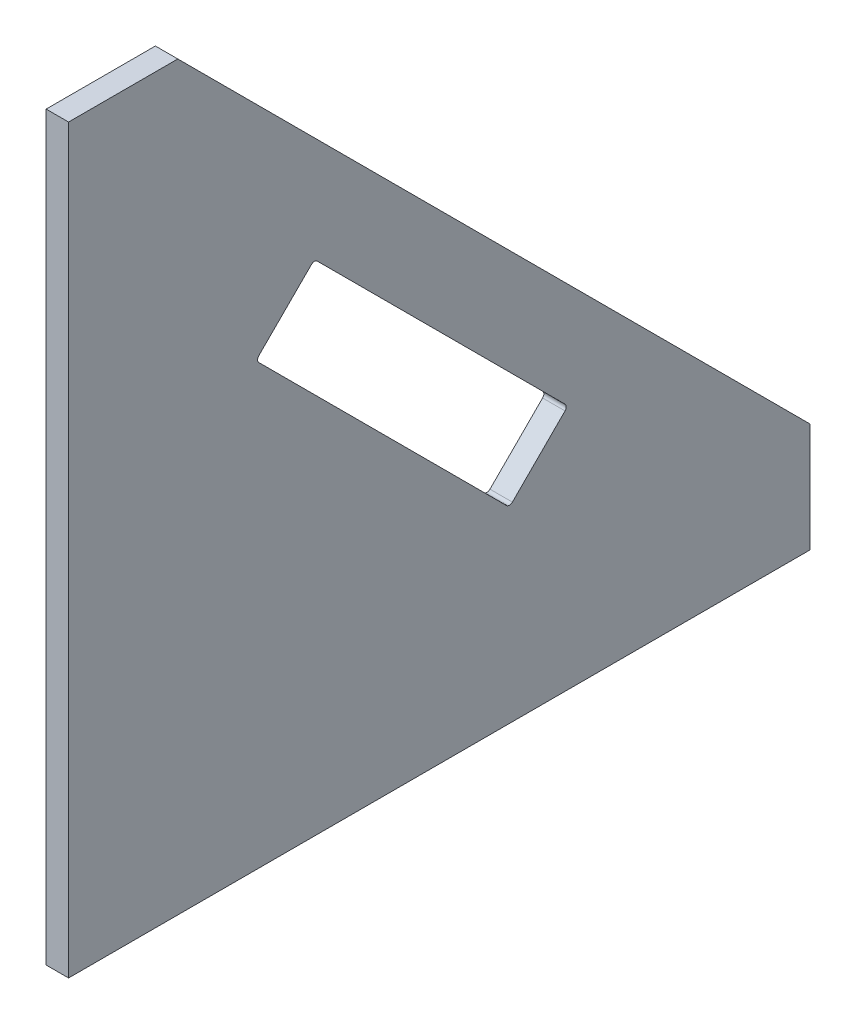
ISO-10303-21;
HEADER;
FILE_DESCRIPTION(('STEP AP214'),'2;1');
FILE_NAME('part.step','',(''),(''),'','','');
FILE_SCHEMA(('AUTOMOTIVE_DESIGN { 1 0 10303 214 1 1 1 1 }'));
ENDSEC;
DATA;
#1=APPLICATION_CONTEXT('core data for automotive mechanical design processes');
#2=APPLICATION_PROTOCOL_DEFINITION('international standard','automotive_design',2000,#1);
#3=PRODUCT_CONTEXT('',#1,'mechanical');
#4=PRODUCT('Part','Part','',(#3));
#5=PRODUCT_RELATED_PRODUCT_CATEGORY('part','',(#4));
#6=PRODUCT_DEFINITION_FORMATION('','',#4);
#7=PRODUCT_DEFINITION_CONTEXT('part definition',#1,'design');
#8=PRODUCT_DEFINITION('design','',#6,#7);
#9=PRODUCT_DEFINITION_SHAPE('','',#8);
#10=(LENGTH_UNIT() NAMED_UNIT(*) SI_UNIT(.MILLI.,.METRE.));
#11=(NAMED_UNIT(*) PLANE_ANGLE_UNIT() SI_UNIT($,.RADIAN.));
#12=(NAMED_UNIT(*) SI_UNIT($,.STERADIAN.) SOLID_ANGLE_UNIT());
#13=UNCERTAINTY_MEASURE_WITH_UNIT(LENGTH_MEASURE(1.E-05),#10,'distance_accuracy_value','');
#14=(GEOMETRIC_REPRESENTATION_CONTEXT(3) GLOBAL_UNCERTAINTY_ASSIGNED_CONTEXT((#13)) GLOBAL_UNIT_ASSIGNED_CONTEXT((#10,
#11,#12)) REPRESENTATION_CONTEXT('',''));
#15=CARTESIAN_POINT('',(0.,0.,0.));
#16=DIRECTION('',(0.,0.,1.));
#17=DIRECTION('',(1.,0.,0.));
#18=AXIS2_PLACEMENT_3D('',#15,#16,#17);
#19=CARTESIAN_POINT('',(18.25625,0.,-603.25));
#20=DIRECTION('',(0.,1.,0.));
#21=DIRECTION('',(0.,0.,1.));
#22=AXIS2_PLACEMENT_3D('',#19,#20,#21);
#23=PLANE('',#22);
#24=DIRECTION('',(0.,0.,-1.));
#25=VECTOR('',#24,1.);
#26=CARTESIAN_POINT('',(0.,0.,-603.25));
#27=LINE('',#26,#25);
#28=CARTESIAN_POINT('',(0.,0.,0.));
#29=VERTEX_POINT('',#28);
#30=CARTESIAN_POINT('',(0.,0.,-603.25));
#31=VERTEX_POINT('',#30);
#32=EDGE_CURVE('E152',#29,#31,#27,.T.);
#33=ORIENTED_EDGE('',*,*,#32,.T.);
#34=DIRECTION('',(-1.,0.,0.));
#35=VECTOR('',#34,1.);
#36=CARTESIAN_POINT('',(18.25625,0.,-603.25));
#37=LINE('',#36,#35);
#38=CARTESIAN_POINT('',(18.25625,0.,-603.25));
#39=VERTEX_POINT('',#38);
#40=EDGE_CURVE('E133',#39,#31,#37,.T.);
#41=ORIENTED_EDGE('',*,*,#40,.F.);
#42=DIRECTION('',(0.,0.,-1.));
#43=VECTOR('',#42,1.);
#44=CARTESIAN_POINT('',(18.25625,0.,-603.25));
#45=LINE('',#44,#43);
#46=CARTESIAN_POINT('',(18.25625,0.,0.));
#47=VERTEX_POINT('',#46);
#48=EDGE_CURVE('E140',#47,#39,#45,.T.);
#49=ORIENTED_EDGE('',*,*,#48,.F.);
#50=DIRECTION('',(-1.,0.,0.));
#51=VECTOR('',#50,1.);
#52=CARTESIAN_POINT('',(18.25625,0.,0.));
#53=LINE('',#52,#51);
#54=EDGE_CURVE('E232',#47,#29,#53,.T.);
#55=ORIENTED_EDGE('',*,*,#54,.T.);
#56=EDGE_LOOP('',(#33,#41,#49,#55));
#57=FACE_BOUND('',#56,.T.);
#58=ADVANCED_FACE('F33',(#57),#23,.F.);
#59=CARTESIAN_POINT('',(18.25625,88.9,-603.25));
#60=DIRECTION('',(0.,0.,1.));
#61=DIRECTION('',(1.,0.,0.));
#62=AXIS2_PLACEMENT_3D('',#59,#60,#61);
#63=PLANE('',#62);
#64=DIRECTION('',(0.,1.,0.));
#65=VECTOR('',#64,1.);
#66=CARTESIAN_POINT('',(0.,88.9,-603.25));
#67=LINE('',#66,#65);
#68=CARTESIAN_POINT('',(0.,88.9,-603.25));
#69=VERTEX_POINT('',#68);
#70=EDGE_CURVE('E217',#31,#69,#67,.T.);
#71=ORIENTED_EDGE('',*,*,#70,.T.);
#72=DIRECTION('',(-1.,0.,0.));
#73=VECTOR('',#72,1.);
#74=CARTESIAN_POINT('',(18.25625,88.9,-603.25));
#75=LINE('',#74,#73);
#76=CARTESIAN_POINT('',(18.25625,88.9,-603.25));
#77=VERTEX_POINT('',#76);
#78=EDGE_CURVE('E136',#77,#69,#75,.T.);
#79=ORIENTED_EDGE('',*,*,#78,.F.);
#80=DIRECTION('',(0.,1.,0.));
#81=VECTOR('',#80,1.);
#82=CARTESIAN_POINT('',(18.25625,88.9,-603.25));
#83=LINE('',#82,#81);
#84=EDGE_CURVE('E129',#39,#77,#83,.T.);
#85=ORIENTED_EDGE('',*,*,#84,.F.);
#86=ORIENTED_EDGE('',*,*,#40,.T.);
#87=EDGE_LOOP('',(#71,#79,#85,#86));
#88=FACE_BOUND('',#87,.T.);
#89=ADVANCED_FACE('F131',(#88),#63,.F.);
#90=CARTESIAN_POINT('',(18.25625,603.25,-88.9));
#91=DIRECTION('',(0.,-0.707106781186548,0.707106781186548));
#92=DIRECTION('',(0.,-0.707106781186548,-0.707106781186548));
#93=AXIS2_PLACEMENT_3D('',#90,#91,#92);
#94=PLANE('',#93);
#95=DIRECTION('',(0.,0.707106781186548,0.707106781186548));
#96=VECTOR('',#95,1.);
#97=CARTESIAN_POINT('',(0.,603.25,-88.9));
#98=LINE('',#97,#96);
#99=CARTESIAN_POINT('',(0.,603.25,-88.9));
#100=VERTEX_POINT('',#99);
#101=EDGE_CURVE('E235',#69,#100,#98,.T.);
#102=ORIENTED_EDGE('',*,*,#101,.T.);
#103=DIRECTION('',(-1.,0.,0.));
#104=VECTOR('',#103,1.);
#105=CARTESIAN_POINT('',(18.25625,603.25,-88.9));
#106=LINE('',#105,#104);
#107=CARTESIAN_POINT('',(18.25625,603.25,-88.9));
#108=VERTEX_POINT('',#107);
#109=EDGE_CURVE('E157',#108,#100,#106,.T.);
#110=ORIENTED_EDGE('',*,*,#109,.F.);
#111=DIRECTION('',(0.,0.707106781186548,0.707106781186548));
#112=VECTOR('',#111,1.);
#113=CARTESIAN_POINT('',(18.25625,603.25,-88.9));
#114=LINE('',#113,#112);
#115=EDGE_CURVE('E139',#77,#108,#114,.T.);
#116=ORIENTED_EDGE('',*,*,#115,.F.);
#117=ORIENTED_EDGE('',*,*,#78,.T.);
#118=EDGE_LOOP('',(#102,#110,#116,#117));
#119=FACE_BOUND('',#118,.T.);
#120=ADVANCED_FACE('F262',(#119),#94,.F.);
#121=CARTESIAN_POINT('',(18.25625,603.25,0.));
#122=DIRECTION('',(0.,-1.,0.));
#123=DIRECTION('',(0.,0.,-1.));
#124=AXIS2_PLACEMENT_3D('',#121,#122,#123);
#125=PLANE('',#124);
#126=DIRECTION('',(0.,0.,1.));
#127=VECTOR('',#126,1.);
#128=CARTESIAN_POINT('',(0.,603.25,0.));
#129=LINE('',#128,#127);
#130=CARTESIAN_POINT('',(0.,603.25,0.));
#131=VERTEX_POINT('',#130);
#132=EDGE_CURVE('E237',#100,#131,#129,.T.);
#133=ORIENTED_EDGE('',*,*,#132,.T.);
#134=DIRECTION('',(-1.,0.,0.));
#135=VECTOR('',#134,1.);
#136=CARTESIAN_POINT('',(18.25625,603.25,0.));
#137=LINE('',#136,#135);
#138=CARTESIAN_POINT('',(18.25625,603.25,0.));
#139=VERTEX_POINT('',#138);
#140=EDGE_CURVE('E241',#139,#131,#137,.T.);
#141=ORIENTED_EDGE('',*,*,#140,.F.);
#142=DIRECTION('',(0.,0.,1.));
#143=VECTOR('',#142,1.);
#144=CARTESIAN_POINT('',(18.25625,603.25,0.));
#145=LINE('',#144,#143);
#146=EDGE_CURVE('E230',#108,#139,#145,.T.);
#147=ORIENTED_EDGE('',*,*,#146,.F.);
#148=ORIENTED_EDGE('',*,*,#109,.T.);
#149=EDGE_LOOP('',(#133,#141,#147,#148));
#150=FACE_BOUND('',#149,.T.);
#151=ADVANCED_FACE('F248',(#150),#125,.F.);
#152=CARTESIAN_POINT('',(18.25625,0.,0.));
#153=DIRECTION('',(0.,0.,-1.));
#154=DIRECTION('',(-1.,0.,0.));
#155=AXIS2_PLACEMENT_3D('',#152,#153,#154);
#156=PLANE('',#155);
#157=DIRECTION('',(0.,-1.,0.));
#158=VECTOR('',#157,1.);
#159=CARTESIAN_POINT('',(0.,0.,0.));
#160=LINE('',#159,#158);
#161=EDGE_CURVE('E149',#131,#29,#160,.T.);
#162=ORIENTED_EDGE('',*,*,#161,.T.);
#163=ORIENTED_EDGE('',*,*,#54,.F.);
#164=DIRECTION('',(0.,-1.,0.));
#165=VECTOR('',#164,1.);
#166=CARTESIAN_POINT('',(18.25625,0.,0.));
#167=LINE('',#166,#165);
#168=EDGE_CURVE('E145',#139,#47,#167,.T.);
#169=ORIENTED_EDGE('',*,*,#168,.F.);
#170=ORIENTED_EDGE('',*,*,#140,.T.);
#171=EDGE_LOOP('',(#162,#163,#169,#170));
#172=FACE_BOUND('',#171,.T.);
#173=ADVANCED_FACE('F254',(#172),#156,.F.);
#174=CARTESIAN_POINT('',(18.25625,0.,0.));
#175=DIRECTION('',(-1.,0.,0.));
#176=DIRECTION('',(0.,0.,1.));
#177=AXIS2_PLACEMENT_3D('',#174,#175,#176);
#178=PLANE('',#177);
#179=DIRECTION('',(0.,-0.707106781186547,-0.707106781186548));
#180=VECTOR('',#179,1.);
#181=CARTESIAN_POINT('',(18.25625,358.775,-152.4));
#182=LINE('',#181,#180);
#183=CARTESIAN_POINT('',(18.25625,356.386251871796,-154.788748128204));
#184=VERTEX_POINT('',#183);
#185=CARTESIAN_POINT('',(18.25625,154.788748128204,-356.386251871796));
#186=VERTEX_POINT('',#185);
#187=EDGE_CURVE('E203',#184,#186,#182,.T.);
#188=ORIENTED_EDGE('',*,*,#187,.F.);
#189=CARTESIAN_POINT('',(18.25625,358.775,-157.177496256409));
#190=DIRECTION('',(-1.,0.,0.));
#191=DIRECTION('',(0.,0.,1.));
#192=AXIS2_PLACEMENT_3D('',#189,#190,#191);
#193=CIRCLE('',#192,3.3782);
#194=CARTESIAN_POINT('',(18.25625,361.163748128204,-154.788748128204));
#195=VERTEX_POINT('',#194);
#196=EDGE_CURVE('E185',#184,#195,#193,.T.);
#197=ORIENTED_EDGE('',*,*,#196,.T.);
#198=DIRECTION('',(0.,-0.707106781186548,0.707106781186547));
#199=VECTOR('',#198,1.);
#200=CARTESIAN_POINT('',(18.25625,406.4,-200.025));
#201=LINE('',#200,#199);
#202=CARTESIAN_POINT('',(18.25625,404.011251871796,-197.636251871796));
#203=VERTEX_POINT('',#202);
#204=EDGE_CURVE('E223',#203,#195,#201,.T.);
#205=ORIENTED_EDGE('',*,*,#204,.F.);
#206=CARTESIAN_POINT('',(18.25625,401.622503743591,-200.025));
#207=DIRECTION('',(-1.,0.,0.));
#208=DIRECTION('',(0.,0.,1.));
#209=AXIS2_PLACEMENT_3D('',#206,#207,#208);
#210=CIRCLE('',#209,3.3782);
#211=CARTESIAN_POINT('',(18.25625,404.011251871796,-202.413748128204));
#212=VERTEX_POINT('',#211);
#213=EDGE_CURVE('E177',#203,#212,#210,.T.);
#214=ORIENTED_EDGE('',*,*,#213,.T.);
#215=DIRECTION('',(0.,0.707106781186548,0.707106781186547));
#216=VECTOR('',#215,1.);
#217=CARTESIAN_POINT('',(18.25625,406.4,-200.025));
#218=LINE('',#217,#216);
#219=CARTESIAN_POINT('',(18.25625,202.413748128204,-404.011251871796));
#220=VERTEX_POINT('',#219);
#221=EDGE_CURVE('E194',#220,#212,#218,.T.);
#222=ORIENTED_EDGE('',*,*,#221,.F.);
#223=CARTESIAN_POINT('',(18.25625,200.025,-401.622503743591));
#224=DIRECTION('',(-1.,0.,0.));
#225=DIRECTION('',(0.,0.,1.));
#226=AXIS2_PLACEMENT_3D('',#223,#224,#225);
#227=CIRCLE('',#226,3.3782);
#228=CARTESIAN_POINT('',(18.25625,197.636251871796,-404.011251871796));
#229=VERTEX_POINT('',#228);
#230=EDGE_CURVE('E41',#220,#229,#227,.T.);
#231=ORIENTED_EDGE('',*,*,#230,.T.);
#232=DIRECTION('',(0.,0.707106781186547,-0.707106781186547));
#233=VECTOR('',#232,1.);
#234=CARTESIAN_POINT('',(18.25625,152.4,-358.775));
#235=LINE('',#234,#233);
#236=CARTESIAN_POINT('',(18.25625,154.788748128204,-361.163748128204));
#237=VERTEX_POINT('',#236);
#238=EDGE_CURVE('E192',#237,#229,#235,.T.);
#239=ORIENTED_EDGE('',*,*,#238,.F.);
#240=CARTESIAN_POINT('',(18.25625,157.177496256409,-358.775));
#241=DIRECTION('',(-1.,0.,0.));
#242=DIRECTION('',(0.,0.,1.));
#243=AXIS2_PLACEMENT_3D('',#240,#241,#242);
#244=CIRCLE('',#243,3.3782);
#245=EDGE_CURVE('E181',#237,#186,#244,.T.);
#246=ORIENTED_EDGE('',*,*,#245,.T.);
#247=EDGE_LOOP('',(#188,#197,#205,#214,#222,#231,#239,#246));
#248=FACE_BOUND('',#247,.T.);
#249=ORIENTED_EDGE('',*,*,#48,.T.);
#250=ORIENTED_EDGE('',*,*,#84,.T.);
#251=ORIENTED_EDGE('',*,*,#115,.T.);
#252=ORIENTED_EDGE('',*,*,#146,.T.);
#253=ORIENTED_EDGE('',*,*,#168,.T.);
#254=EDGE_LOOP('',(#249,#250,#251,#252,#253));
#255=FACE_BOUND('',#254,.T.);
#256=ADVANCED_FACE('F143',(#248,#255),#178,.F.);
#257=CARTESIAN_POINT('',(0.,0.,0.));
#258=DIRECTION('',(-1.,0.,0.));
#259=DIRECTION('',(0.,0.,1.));
#260=AXIS2_PLACEMENT_3D('',#257,#258,#259);
#261=PLANE('',#260);
#262=DIRECTION('',(0.,0.707106781186548,0.707106781186547));
#263=VECTOR('',#262,1.);
#264=CARTESIAN_POINT('',(0.,406.4,-200.025));
#265=LINE('',#264,#263);
#266=CARTESIAN_POINT('',(0.,202.413748128204,-404.011251871796));
#267=VERTEX_POINT('',#266);
#268=CARTESIAN_POINT('',(0.,404.011251871796,-202.413748128204));
#269=VERTEX_POINT('',#268);
#270=EDGE_CURVE('E210',#267,#269,#265,.T.);
#271=ORIENTED_EDGE('',*,*,#270,.T.);
#272=CARTESIAN_POINT('',(0.,401.622503743591,-200.025));
#273=DIRECTION('',(-1.,0.,0.));
#274=DIRECTION('',(0.,0.,1.));
#275=AXIS2_PLACEMENT_3D('',#272,#273,#274);
#276=CIRCLE('',#275,3.3782);
#277=CARTESIAN_POINT('',(0.,404.011251871796,-197.636251871796));
#278=VERTEX_POINT('',#277);
#279=EDGE_CURVE('E179',#269,#278,#276,.F.);
#280=ORIENTED_EDGE('',*,*,#279,.T.);
#281=DIRECTION('',(0.,-0.707106781186548,0.707106781186547));
#282=VECTOR('',#281,1.);
#283=CARTESIAN_POINT('',(0.,406.4,-200.025));
#284=LINE('',#283,#282);
#285=CARTESIAN_POINT('',(0.,361.163748128204,-154.788748128204));
#286=VERTEX_POINT('',#285);
#287=EDGE_CURVE('E227',#278,#286,#284,.T.);
#288=ORIENTED_EDGE('',*,*,#287,.T.);
#289=CARTESIAN_POINT('',(0.,358.775,-157.177496256409));
#290=DIRECTION('',(-1.,0.,0.));
#291=DIRECTION('',(0.,0.,1.));
#292=AXIS2_PLACEMENT_3D('',#289,#290,#291);
#293=CIRCLE('',#292,3.3782);
#294=CARTESIAN_POINT('',(0.,356.386251871796,-154.788748128204));
#295=VERTEX_POINT('',#294);
#296=EDGE_CURVE('E55',#286,#295,#293,.F.);
#297=ORIENTED_EDGE('',*,*,#296,.T.);
#298=DIRECTION('',(0.,-0.707106781186547,-0.707106781186548));
#299=VECTOR('',#298,1.);
#300=CARTESIAN_POINT('',(0.,358.775,-152.4));
#301=LINE('',#300,#299);
#302=CARTESIAN_POINT('',(0.,154.788748128204,-356.386251871796));
#303=VERTEX_POINT('',#302);
#304=EDGE_CURVE('E219',#295,#303,#301,.T.);
#305=ORIENTED_EDGE('',*,*,#304,.T.);
#306=CARTESIAN_POINT('',(0.,157.177496256409,-358.775));
#307=DIRECTION('',(-1.,0.,0.));
#308=DIRECTION('',(0.,0.,1.));
#309=AXIS2_PLACEMENT_3D('',#306,#307,#308);
#310=CIRCLE('',#309,3.3782);
#311=CARTESIAN_POINT('',(0.,154.788748128204,-361.163748128204));
#312=VERTEX_POINT('',#311);
#313=EDGE_CURVE('E183',#303,#312,#310,.F.);
#314=ORIENTED_EDGE('',*,*,#313,.T.);
#315=DIRECTION('',(0.,0.707106781186547,-0.707106781186547));
#316=VECTOR('',#315,1.);
#317=CARTESIAN_POINT('',(0.,152.4,-358.775));
#318=LINE('',#317,#316);
#319=CARTESIAN_POINT('',(0.,197.636251871796,-404.011251871796));
#320=VERTEX_POINT('',#319);
#321=EDGE_CURVE('E212',#312,#320,#318,.T.);
#322=ORIENTED_EDGE('',*,*,#321,.T.);
#323=CARTESIAN_POINT('',(0.,200.025,-401.622503743591));
#324=DIRECTION('',(-1.,0.,0.));
#325=DIRECTION('',(0.,0.,1.));
#326=AXIS2_PLACEMENT_3D('',#323,#324,#325);
#327=CIRCLE('',#326,3.3782);
#328=EDGE_CURVE('E11',#320,#267,#327,.F.);
#329=ORIENTED_EDGE('',*,*,#328,.T.);
#330=EDGE_LOOP('',(#271,#280,#288,#297,#305,#314,#322,#329));
#331=FACE_BOUND('',#330,.T.);
#332=ORIENTED_EDGE('',*,*,#32,.F.);
#333=ORIENTED_EDGE('',*,*,#161,.F.);
#334=ORIENTED_EDGE('',*,*,#132,.F.);
#335=ORIENTED_EDGE('',*,*,#101,.F.);
#336=ORIENTED_EDGE('',*,*,#70,.F.);
#337=EDGE_LOOP('',(#332,#333,#334,#335,#336));
#338=FACE_BOUND('',#337,.T.);
#339=ADVANCED_FACE('F208',(#331,#338),#261,.T.);
#340=CARTESIAN_POINT('',(0.,406.4,-200.025));
#341=DIRECTION('',(0.,0.707106781186547,0.707106781186548));
#342=DIRECTION('',(0.,-0.707106781186548,0.707106781186547));
#343=AXIS2_PLACEMENT_3D('',#340,#341,#342);
#344=PLANE('',#343);
#345=ORIENTED_EDGE('',*,*,#287,.F.);
#346=DIRECTION('',(1.,0.,0.));
#347=VECTOR('',#346,1.);
#348=CARTESIAN_POINT('',(18.25625,404.011251871796,-197.636251871796));
#349=LINE('',#348,#347);
#350=EDGE_CURVE('E155',#278,#203,#349,.T.);
#351=ORIENTED_EDGE('',*,*,#350,.T.);
#352=ORIENTED_EDGE('',*,*,#204,.T.);
#353=DIRECTION('',(1.,0.,0.));
#354=VECTOR('',#353,1.);
#355=CARTESIAN_POINT('',(0.,361.163748128204,-154.788748128204));
#356=LINE('',#355,#354);
#357=EDGE_CURVE('E153',#195,#286,#356,.F.);
#358=ORIENTED_EDGE('',*,*,#357,.T.);
#359=EDGE_LOOP('',(#345,#351,#352,#358));
#360=FACE_BOUND('',#359,.T.);
#361=ADVANCED_FACE('F295',(#360),#344,.F.);
#362=CARTESIAN_POINT('',(0.,406.4,-200.025));
#363=DIRECTION('',(0.,0.707106781186547,-0.707106781186548));
#364=DIRECTION('',(0.,0.707106781186548,0.707106781186547));
#365=AXIS2_PLACEMENT_3D('',#362,#363,#364);
#366=PLANE('',#365);
#367=ORIENTED_EDGE('',*,*,#221,.T.);
#368=DIRECTION('',(1.,0.,0.));
#369=VECTOR('',#368,1.);
#370=CARTESIAN_POINT('',(0.,404.011251871796,-202.413748128204));
#371=LINE('',#370,#369);
#372=EDGE_CURVE('E166',#212,#269,#371,.F.);
#373=ORIENTED_EDGE('',*,*,#372,.T.);
#374=ORIENTED_EDGE('',*,*,#270,.F.);
#375=DIRECTION('',(1.,0.,0.));
#376=VECTOR('',#375,1.);
#377=CARTESIAN_POINT('',(18.25625,202.413748128204,-404.011251871796));
#378=LINE('',#377,#376);
#379=EDGE_CURVE('E163',#267,#220,#378,.T.);
#380=ORIENTED_EDGE('',*,*,#379,.T.);
#381=EDGE_LOOP('',(#367,#373,#374,#380));
#382=FACE_BOUND('',#381,.T.);
#383=ADVANCED_FACE('F214',(#382),#366,.F.);
#384=CARTESIAN_POINT('',(0.,152.4,-358.775));
#385=DIRECTION('',(0.,-0.707106781186548,-0.707106781186548));
#386=DIRECTION('',(0.,0.707106781186548,-0.707106781186548));
#387=AXIS2_PLACEMENT_3D('',#384,#385,#386);
#388=PLANE('',#387);
#389=ORIENTED_EDGE('',*,*,#321,.F.);
#390=DIRECTION('',(1.,0.,0.));
#391=VECTOR('',#390,1.);
#392=CARTESIAN_POINT('',(18.25625,154.788748128204,-361.163748128204));
#393=LINE('',#392,#391);
#394=EDGE_CURVE('E170',#312,#237,#393,.T.);
#395=ORIENTED_EDGE('',*,*,#394,.T.);
#396=ORIENTED_EDGE('',*,*,#238,.T.);
#397=DIRECTION('',(1.,0.,0.));
#398=VECTOR('',#397,1.);
#399=CARTESIAN_POINT('',(0.,197.636251871796,-404.011251871796));
#400=LINE('',#399,#398);
#401=EDGE_CURVE('E168',#229,#320,#400,.F.);
#402=ORIENTED_EDGE('',*,*,#401,.T.);
#403=EDGE_LOOP('',(#389,#395,#396,#402));
#404=FACE_BOUND('',#403,.T.);
#405=ADVANCED_FACE('F200',(#404),#388,.F.);
#406=CARTESIAN_POINT('',(0.,358.775,-152.4));
#407=DIRECTION('',(0.,-0.707106781186548,0.707106781186547));
#408=DIRECTION('',(0.,-0.707106781186547,-0.707106781186548));
#409=AXIS2_PLACEMENT_3D('',#406,#407,#408);
#410=PLANE('',#409);
#411=ORIENTED_EDGE('',*,*,#187,.T.);
#412=DIRECTION('',(1.,0.,0.));
#413=VECTOR('',#412,1.);
#414=CARTESIAN_POINT('',(0.,154.788748128204,-356.386251871796));
#415=LINE('',#414,#413);
#416=EDGE_CURVE('E48',#186,#303,#415,.F.);
#417=ORIENTED_EDGE('',*,*,#416,.T.);
#418=ORIENTED_EDGE('',*,*,#304,.F.);
#419=DIRECTION('',(1.,0.,0.));
#420=VECTOR('',#419,1.);
#421=CARTESIAN_POINT('',(18.25625,356.386251871796,-154.788748128204));
#422=LINE('',#421,#420);
#423=EDGE_CURVE('E173',#295,#184,#422,.T.);
#424=ORIENTED_EDGE('',*,*,#423,.T.);
#425=EDGE_LOOP('',(#411,#417,#418,#424));
#426=FACE_BOUND('',#425,.T.);
#427=ADVANCED_FACE('F277',(#426),#410,.F.);
#428=CARTESIAN_POINT('',(0.,401.622503743591,-200.025));
#429=DIRECTION('',(-1.,0.,0.));
#430=DIRECTION('',(0.,0.,1.));
#431=AXIS2_PLACEMENT_3D('',#428,#429,#430);
#432=CYLINDRICAL_SURFACE('',#431,3.3782);
#433=ORIENTED_EDGE('',*,*,#279,.F.);
#434=ORIENTED_EDGE('',*,*,#372,.F.);
#435=ORIENTED_EDGE('',*,*,#213,.F.);
#436=ORIENTED_EDGE('',*,*,#350,.F.);
#437=EDGE_LOOP('',(#433,#434,#435,#436));
#438=FACE_BOUND('',#437,.T.);
#439=ADVANCED_FACE('F273',(#438),#432,.F.);
#440=CARTESIAN_POINT('',(0.,157.177496256409,-358.775));
#441=DIRECTION('',(-1.,0.,0.));
#442=DIRECTION('',(0.,0.,1.));
#443=AXIS2_PLACEMENT_3D('',#440,#441,#442);
#444=CYLINDRICAL_SURFACE('',#443,3.3782);
#445=ORIENTED_EDGE('',*,*,#313,.F.);
#446=ORIENTED_EDGE('',*,*,#416,.F.);
#447=ORIENTED_EDGE('',*,*,#245,.F.);
#448=ORIENTED_EDGE('',*,*,#394,.F.);
#449=EDGE_LOOP('',(#445,#446,#447,#448));
#450=FACE_BOUND('',#449,.T.);
#451=ADVANCED_FACE('F276',(#450),#444,.F.);
#452=CARTESIAN_POINT('',(0.,358.775,-157.177496256409));
#453=DIRECTION('',(-1.,0.,0.));
#454=DIRECTION('',(0.,0.,1.));
#455=AXIS2_PLACEMENT_3D('',#452,#453,#454);
#456=CYLINDRICAL_SURFACE('',#455,3.3782);
#457=ORIENTED_EDGE('',*,*,#296,.F.);
#458=ORIENTED_EDGE('',*,*,#357,.F.);
#459=ORIENTED_EDGE('',*,*,#196,.F.);
#460=ORIENTED_EDGE('',*,*,#423,.F.);
#461=EDGE_LOOP('',(#457,#458,#459,#460));
#462=FACE_BOUND('',#461,.T.);
#463=ADVANCED_FACE('F280',(#462),#456,.F.);
#464=CARTESIAN_POINT('',(0.,200.025,-401.622503743591));
#465=DIRECTION('',(-1.,0.,0.));
#466=DIRECTION('',(0.,0.,1.));
#467=AXIS2_PLACEMENT_3D('',#464,#465,#466);
#468=CYLINDRICAL_SURFACE('',#467,3.3782);
#469=ORIENTED_EDGE('',*,*,#328,.F.);
#470=ORIENTED_EDGE('',*,*,#401,.F.);
#471=ORIENTED_EDGE('',*,*,#230,.F.);
#472=ORIENTED_EDGE('',*,*,#379,.F.);
#473=EDGE_LOOP('',(#469,#470,#471,#472));
#474=FACE_BOUND('',#473,.T.);
#475=ADVANCED_FACE('F35',(#474),#468,.F.);
#476=CLOSED_SHELL('',(#58,#89,#120,#151,#173,#256,#339,#361,#383,#405,#427,#439,#451,#463,#475));
#477=MANIFOLD_SOLID_BREP('B2',#476);
#478=ADVANCED_BREP_SHAPE_REPRESENTATION('',(#18,#477),#14);
#479=SHAPE_DEFINITION_REPRESENTATION(#9,#478);
ENDSEC;
END-ISO-10303-21;
